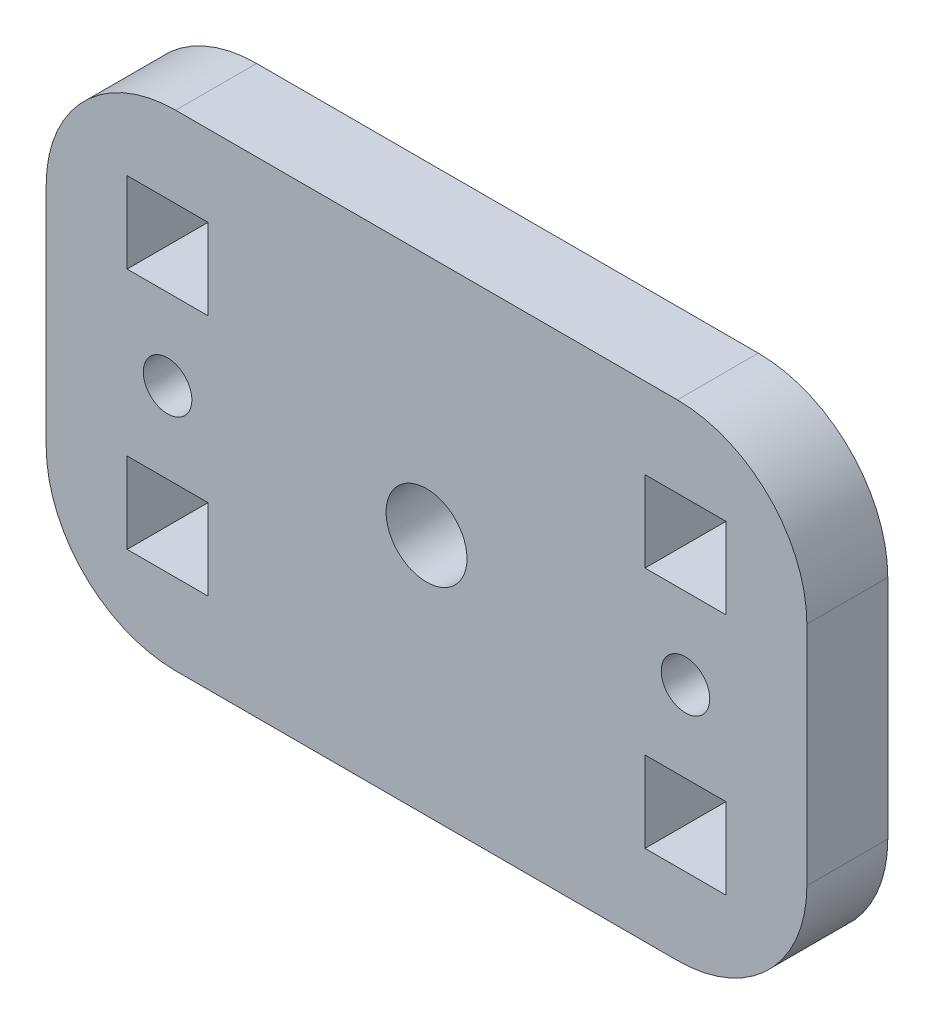
ISO-10303-21;
HEADER;
FILE_DESCRIPTION(('STEP AP214'),'2;1');
FILE_NAME('part.step','',(''),(''),'','','');
FILE_SCHEMA(('AUTOMOTIVE_DESIGN { 1 0 10303 214 1 1 1 1 }'));
ENDSEC;
DATA;
#1=APPLICATION_CONTEXT('core data for automotive mechanical design processes');
#2=APPLICATION_PROTOCOL_DEFINITION('international standard','automotive_design',2000,#1);
#3=PRODUCT_CONTEXT('',#1,'mechanical');
#4=PRODUCT('Part','Part','',(#3));
#5=PRODUCT_RELATED_PRODUCT_CATEGORY('part','',(#4));
#6=PRODUCT_DEFINITION_FORMATION('','',#4);
#7=PRODUCT_DEFINITION_CONTEXT('part definition',#1,'design');
#8=PRODUCT_DEFINITION('design','',#6,#7);
#9=PRODUCT_DEFINITION_SHAPE('','',#8);
#10=(LENGTH_UNIT() NAMED_UNIT(*) SI_UNIT(.MILLI.,.METRE.));
#11=(NAMED_UNIT(*) PLANE_ANGLE_UNIT() SI_UNIT($,.RADIAN.));
#12=(NAMED_UNIT(*) SI_UNIT($,.STERADIAN.) SOLID_ANGLE_UNIT());
#13=UNCERTAINTY_MEASURE_WITH_UNIT(LENGTH_MEASURE(1.E-05),#10,'distance_accuracy_value','');
#14=(GEOMETRIC_REPRESENTATION_CONTEXT(3) GLOBAL_UNCERTAINTY_ASSIGNED_CONTEXT((#13)) GLOBAL_UNIT_ASSIGNED_CONTEXT((#10,
#11,#12)) REPRESENTATION_CONTEXT('',''));
#15=CARTESIAN_POINT('',(0.,0.,0.));
#16=DIRECTION('',(0.,0.,1.));
#17=DIRECTION('',(1.,0.,0.));
#18=AXIS2_PLACEMENT_3D('',#15,#16,#17);
#19=CARTESIAN_POINT('',(8.,8.,5.));
#20=DIRECTION('',(0.,0.,-1.));
#21=DIRECTION('',(-1.,0.,0.));
#22=AXIS2_PLACEMENT_3D('',#19,#20,#21);
#23=PLANE('',#22);
#24=DIRECTION('',(1.,0.,0.));
#25=VECTOR('',#24,1.);
#26=CARTESIAN_POINT('',(37.,5.,5.));
#27=LINE('',#26,#25);
#28=CARTESIAN_POINT('',(37.,5.,5.));
#29=VERTEX_POINT('',#28);
#30=CARTESIAN_POINT('',(42.,5.,5.));
#31=VERTEX_POINT('',#30);
#32=EDGE_CURVE('E233',#29,#31,#27,.T.);
#33=ORIENTED_EDGE('',*,*,#32,.F.);
#34=DIRECTION('',(0.,-1.,0.));
#35=VECTOR('',#34,1.);
#36=CARTESIAN_POINT('',(37.,5.,5.));
#37=LINE('',#36,#35);
#38=CARTESIAN_POINT('',(37.,9.99999999999999,5.));
#39=VERTEX_POINT('',#38);
#40=EDGE_CURVE('E241',#39,#29,#37,.T.);
#41=ORIENTED_EDGE('',*,*,#40,.F.);
#42=DIRECTION('',(-1.,0.,0.));
#43=VECTOR('',#42,1.);
#44=CARTESIAN_POINT('',(37.,9.99999999999999,5.));
#45=LINE('',#44,#43);
#46=CARTESIAN_POINT('',(42.,9.99999999999999,5.));
#47=VERTEX_POINT('',#46);
#48=EDGE_CURVE('E238',#47,#39,#45,.T.);
#49=ORIENTED_EDGE('',*,*,#48,.F.);
#50=DIRECTION('',(0.,1.,0.));
#51=VECTOR('',#50,1.);
#52=CARTESIAN_POINT('',(42.,5.,5.));
#53=LINE('',#52,#51);
#54=EDGE_CURVE('E235',#31,#47,#53,.T.);
#55=ORIENTED_EDGE('',*,*,#54,.F.);
#56=EDGE_LOOP('',(#33,#41,#49,#55));
#57=FACE_BOUND('',#56,.T.);
#58=CARTESIAN_POINT('',(7.5,15.,5.));
#59=DIRECTION('',(0.,0.,1.));
#60=DIRECTION('',(1.,0.,0.));
#61=AXIS2_PLACEMENT_3D('',#58,#59,#60);
#62=CIRCLE('',#61,1.5);
#63=CARTESIAN_POINT('',(9.,15.,5.));
#64=VERTEX_POINT('',#63);
#65=EDGE_CURVE('E301',#64,#64,#62,.T.);
#66=ORIENTED_EDGE('',*,*,#65,.F.);
#67=EDGE_LOOP('',(#66));
#68=FACE_BOUND('',#67,.T.);
#69=DIRECTION('',(0.,-1.,0.));
#70=VECTOR('',#69,1.);
#71=CARTESIAN_POINT('',(5.,25.,5.));
#72=LINE('',#71,#70);
#73=CARTESIAN_POINT('',(5.,25.,5.));
#74=VERTEX_POINT('',#73);
#75=CARTESIAN_POINT('',(5.,20.,5.));
#76=VERTEX_POINT('',#75);
#77=EDGE_CURVE('E307',#74,#76,#72,.T.);
#78=ORIENTED_EDGE('',*,*,#77,.F.);
#79=DIRECTION('',(-1.,0.,0.));
#80=VECTOR('',#79,1.);
#81=CARTESIAN_POINT('',(5.,25.,5.));
#82=LINE('',#81,#80);
#83=CARTESIAN_POINT('',(10.,25.,5.));
#84=VERTEX_POINT('',#83);
#85=EDGE_CURVE('E315',#84,#74,#82,.T.);
#86=ORIENTED_EDGE('',*,*,#85,.F.);
#87=DIRECTION('',(0.,1.,0.));
#88=VECTOR('',#87,1.);
#89=CARTESIAN_POINT('',(10.,25.,5.));
#90=LINE('',#89,#88);
#91=CARTESIAN_POINT('',(10.,20.,5.));
#92=VERTEX_POINT('',#91);
#93=EDGE_CURVE('E312',#92,#84,#90,.T.);
#94=ORIENTED_EDGE('',*,*,#93,.F.);
#95=DIRECTION('',(1.,0.,0.));
#96=VECTOR('',#95,1.);
#97=CARTESIAN_POINT('',(5.,20.,5.));
#98=LINE('',#97,#96);
#99=EDGE_CURVE('E309',#76,#92,#98,.T.);
#100=ORIENTED_EDGE('',*,*,#99,.F.);
#101=EDGE_LOOP('',(#78,#86,#94,#100));
#102=FACE_BOUND('',#101,.T.);
#103=CARTESIAN_POINT('',(8.,8.,5.));
#104=DIRECTION('',(0.,0.,1.));
#105=DIRECTION('',(-1.,0.,0.));
#106=AXIS2_PLACEMENT_3D('',#103,#104,#105);
#107=CIRCLE('',#106,8.);
#108=CARTESIAN_POINT('',(0.,8.00000000000006,5.));
#109=VERTEX_POINT('',#108);
#110=CARTESIAN_POINT('',(8.00000000000006,0.,5.));
#111=VERTEX_POINT('',#110);
#112=EDGE_CURVE('E338',#109,#111,#107,.T.);
#113=ORIENTED_EDGE('',*,*,#112,.T.);
#114=DIRECTION('',(1.,0.,0.));
#115=VECTOR('',#114,1.);
#116=CARTESIAN_POINT('',(8.00000000000006,0.,5.));
#117=LINE('',#116,#115);
#118=CARTESIAN_POINT('',(39.,0.,5.));
#119=VERTEX_POINT('',#118);
#120=EDGE_CURVE('E341',#111,#119,#117,.T.);
#121=ORIENTED_EDGE('',*,*,#120,.T.);
#122=CARTESIAN_POINT('',(39.,8.,5.));
#123=DIRECTION('',(0.,0.,1.));
#124=DIRECTION('',(1.,0.,0.));
#125=AXIS2_PLACEMENT_3D('',#122,#123,#124);
#126=CIRCLE('',#125,8.);
#127=CARTESIAN_POINT('',(47.,8.,5.));
#128=VERTEX_POINT('',#127);
#129=EDGE_CURVE('E344',#119,#128,#126,.T.);
#130=ORIENTED_EDGE('',*,*,#129,.T.);
#131=DIRECTION('',(0.,1.,0.));
#132=VECTOR('',#131,1.);
#133=CARTESIAN_POINT('',(47.,8.,5.));
#134=LINE('',#133,#132);
#135=CARTESIAN_POINT('',(47.,22.,5.));
#136=VERTEX_POINT('',#135);
#137=EDGE_CURVE('E346',#128,#136,#134,.T.);
#138=ORIENTED_EDGE('',*,*,#137,.T.);
#139=CARTESIAN_POINT('',(39.,22.,5.));
#140=DIRECTION('',(0.,0.,1.));
#141=DIRECTION('',(-1.,0.,0.));
#142=AXIS2_PLACEMENT_3D('',#139,#140,#141);
#143=CIRCLE('',#142,8.);
#144=CARTESIAN_POINT('',(39.,30.,5.));
#145=VERTEX_POINT('',#144);
#146=EDGE_CURVE('E348',#136,#145,#143,.T.);
#147=ORIENTED_EDGE('',*,*,#146,.T.);
#148=DIRECTION('',(-1.,0.,0.));
#149=VECTOR('',#148,1.);
#150=CARTESIAN_POINT('',(8.,30.,5.));
#151=LINE('',#150,#149);
#152=CARTESIAN_POINT('',(8.,30.,5.));
#153=VERTEX_POINT('',#152);
#154=EDGE_CURVE('E350',#145,#153,#151,.T.);
#155=ORIENTED_EDGE('',*,*,#154,.T.);
#156=CARTESIAN_POINT('',(8.,22.,5.));
#157=DIRECTION('',(0.,0.,1.));
#158=DIRECTION('',(-1.,0.,0.));
#159=AXIS2_PLACEMENT_3D('',#156,#157,#158);
#160=CIRCLE('',#159,8.);
#161=CARTESIAN_POINT('',(0.,22.,5.));
#162=VERTEX_POINT('',#161);
#163=EDGE_CURVE('E352',#153,#162,#160,.T.);
#164=ORIENTED_EDGE('',*,*,#163,.T.);
#165=DIRECTION('',(0.,-1.,0.));
#166=VECTOR('',#165,1.);
#167=CARTESIAN_POINT('',(0.,8.00000000000006,5.));
#168=LINE('',#167,#166);
#169=EDGE_CURVE('E354',#162,#109,#168,.T.);
#170=ORIENTED_EDGE('',*,*,#169,.T.);
#171=EDGE_LOOP('',(#113,#121,#130,#138,#147,#155,#164,#170));
#172=FACE_BOUND('',#171,.T.);
#173=DIRECTION('',(0.,-1.,0.));
#174=VECTOR('',#173,1.);
#175=CARTESIAN_POINT('',(37.,25.,5.));
#176=LINE('',#175,#174);
#177=CARTESIAN_POINT('',(37.,25.,5.));
#178=VERTEX_POINT('',#177);
#179=CARTESIAN_POINT('',(37.,20.,5.));
#180=VERTEX_POINT('',#179);
#181=EDGE_CURVE('E270',#178,#180,#176,.T.);
#182=ORIENTED_EDGE('',*,*,#181,.F.);
#183=DIRECTION('',(-1.,0.,0.));
#184=VECTOR('',#183,1.);
#185=CARTESIAN_POINT('',(37.,25.,5.));
#186=LINE('',#185,#184);
#187=CARTESIAN_POINT('',(42.,25.,5.));
#188=VERTEX_POINT('',#187);
#189=EDGE_CURVE('E278',#188,#178,#186,.T.);
#190=ORIENTED_EDGE('',*,*,#189,.F.);
#191=DIRECTION('',(0.,1.,0.));
#192=VECTOR('',#191,1.);
#193=CARTESIAN_POINT('',(42.,25.,5.));
#194=LINE('',#193,#192);
#195=CARTESIAN_POINT('',(42.,20.,5.));
#196=VERTEX_POINT('',#195);
#197=EDGE_CURVE('E275',#196,#188,#194,.T.);
#198=ORIENTED_EDGE('',*,*,#197,.F.);
#199=DIRECTION('',(1.,0.,0.));
#200=VECTOR('',#199,1.);
#201=CARTESIAN_POINT('',(37.,20.,5.));
#202=LINE('',#201,#200);
#203=EDGE_CURVE('E272',#180,#196,#202,.T.);
#204=ORIENTED_EDGE('',*,*,#203,.F.);
#205=EDGE_LOOP('',(#182,#190,#198,#204));
#206=FACE_BOUND('',#205,.T.);
#207=CARTESIAN_POINT('',(39.5,15.,5.));
#208=DIRECTION('',(0.,0.,1.));
#209=DIRECTION('',(1.,0.,0.));
#210=AXIS2_PLACEMENT_3D('',#207,#208,#209);
#211=CIRCLE('',#210,1.5);
#212=CARTESIAN_POINT('',(41.,15.,5.));
#213=VERTEX_POINT('',#212);
#214=EDGE_CURVE('E264',#213,#213,#211,.T.);
#215=ORIENTED_EDGE('',*,*,#214,.F.);
#216=EDGE_LOOP('',(#215));
#217=FACE_BOUND('',#216,.T.);
#218=DIRECTION('',(1.,0.,0.));
#219=VECTOR('',#218,1.);
#220=CARTESIAN_POINT('',(5.,4.99999999999999,5.));
#221=LINE('',#220,#219);
#222=CARTESIAN_POINT('',(5.,4.99999999999999,5.));
#223=VERTEX_POINT('',#222);
#224=CARTESIAN_POINT('',(10.,4.99999999999999,5.));
#225=VERTEX_POINT('',#224);
#226=EDGE_CURVE('E194',#223,#225,#221,.T.);
#227=ORIENTED_EDGE('',*,*,#226,.F.);
#228=DIRECTION('',(0.,-1.,0.));
#229=VECTOR('',#228,1.);
#230=CARTESIAN_POINT('',(5.,4.99999999999999,5.));
#231=LINE('',#230,#229);
#232=CARTESIAN_POINT('',(4.99999999999999,9.99999999999999,5.));
#233=VERTEX_POINT('',#232);
#234=EDGE_CURVE('E217',#233,#223,#231,.T.);
#235=ORIENTED_EDGE('',*,*,#234,.F.);
#236=DIRECTION('',(-1.,0.,0.));
#237=VECTOR('',#236,1.);
#238=CARTESIAN_POINT('',(4.99999999999999,9.99999999999999,5.));
#239=LINE('',#238,#237);
#240=CARTESIAN_POINT('',(9.99999999999999,9.99999999999999,5.));
#241=VERTEX_POINT('',#240);
#242=EDGE_CURVE('E215',#241,#233,#239,.T.);
#243=ORIENTED_EDGE('',*,*,#242,.F.);
#244=DIRECTION('',(0.,1.,0.));
#245=VECTOR('',#244,1.);
#246=CARTESIAN_POINT('',(10.,4.99999999999999,5.));
#247=LINE('',#246,#245);
#248=EDGE_CURVE('E202',#225,#241,#247,.T.);
#249=ORIENTED_EDGE('',*,*,#248,.F.);
#250=EDGE_LOOP('',(#227,#235,#243,#249));
#251=FACE_BOUND('',#250,.T.);
#252=CARTESIAN_POINT('',(23.5,15.,5.));
#253=DIRECTION('',(0.,0.,1.));
#254=DIRECTION('',(1.,0.,0.));
#255=AXIS2_PLACEMENT_3D('',#252,#253,#254);
#256=CIRCLE('',#255,2.5);
#257=CARTESIAN_POINT('',(26.,15.,5.));
#258=VERTEX_POINT('',#257);
#259=EDGE_CURVE('E223',#258,#258,#256,.T.);
#260=ORIENTED_EDGE('',*,*,#259,.F.);
#261=EDGE_LOOP('',(#260));
#262=FACE_BOUND('',#261,.T.);
#263=ADVANCED_FACE('F33',(#57,#68,#102,#172,#206,#217,#251,#262),#23,.F.);
#264=CARTESIAN_POINT('',(8.,8.,0.));
#265=DIRECTION('',(0.,0.,-1.));
#266=DIRECTION('',(-1.,0.,0.));
#267=AXIS2_PLACEMENT_3D('',#264,#265,#266);
#268=PLANE('',#267);
#269=DIRECTION('',(0.,-1.,0.));
#270=VECTOR('',#269,1.);
#271=CARTESIAN_POINT('',(5.,4.99999999999999,0.));
#272=LINE('',#271,#270);
#273=CARTESIAN_POINT('',(4.99999999999999,9.99999999999999,0.));
#274=VERTEX_POINT('',#273);
#275=CARTESIAN_POINT('',(5.,4.99999999999999,0.));
#276=VERTEX_POINT('',#275);
#277=EDGE_CURVE('E203',#274,#276,#272,.T.);
#278=ORIENTED_EDGE('',*,*,#277,.T.);
#279=DIRECTION('',(1.,0.,0.));
#280=VECTOR('',#279,1.);
#281=CARTESIAN_POINT('',(5.,4.99999999999999,0.));
#282=LINE('',#281,#280);
#283=CARTESIAN_POINT('',(10.,4.99999999999999,0.));
#284=VERTEX_POINT('',#283);
#285=EDGE_CURVE('E56',#276,#284,#282,.T.);
#286=ORIENTED_EDGE('',*,*,#285,.T.);
#287=DIRECTION('',(0.,1.,0.));
#288=VECTOR('',#287,1.);
#289=CARTESIAN_POINT('',(10.,4.99999999999999,0.));
#290=LINE('',#289,#288);
#291=CARTESIAN_POINT('',(9.99999999999999,9.99999999999999,0.));
#292=VERTEX_POINT('',#291);
#293=EDGE_CURVE('E209',#284,#292,#290,.T.);
#294=ORIENTED_EDGE('',*,*,#293,.T.);
#295=DIRECTION('',(-1.,0.,0.));
#296=VECTOR('',#295,1.);
#297=CARTESIAN_POINT('',(4.99999999999999,9.99999999999999,0.));
#298=LINE('',#297,#296);
#299=EDGE_CURVE('E225',#292,#274,#298,.T.);
#300=ORIENTED_EDGE('',*,*,#299,.T.);
#301=EDGE_LOOP('',(#278,#286,#294,#300));
#302=FACE_BOUND('',#301,.T.);
#303=DIRECTION('',(0.,-1.,0.));
#304=VECTOR('',#303,1.);
#305=CARTESIAN_POINT('',(37.,5.,0.));
#306=LINE('',#305,#304);
#307=CARTESIAN_POINT('',(37.,9.99999999999999,0.));
#308=VERTEX_POINT('',#307);
#309=CARTESIAN_POINT('',(37.,5.,0.));
#310=VERTEX_POINT('',#309);
#311=EDGE_CURVE('E236',#308,#310,#306,.T.);
#312=ORIENTED_EDGE('',*,*,#311,.T.);
#313=DIRECTION('',(1.,0.,0.));
#314=VECTOR('',#313,1.);
#315=CARTESIAN_POINT('',(37.,5.,0.));
#316=LINE('',#315,#314);
#317=CARTESIAN_POINT('',(42.,5.,0.));
#318=VERTEX_POINT('',#317);
#319=EDGE_CURVE('E210',#310,#318,#316,.T.);
#320=ORIENTED_EDGE('',*,*,#319,.T.);
#321=DIRECTION('',(0.,1.,0.));
#322=VECTOR('',#321,1.);
#323=CARTESIAN_POINT('',(42.,5.,0.));
#324=LINE('',#323,#322);
#325=CARTESIAN_POINT('',(42.,9.99999999999999,0.));
#326=VERTEX_POINT('',#325);
#327=EDGE_CURVE('E246',#318,#326,#324,.T.);
#328=ORIENTED_EDGE('',*,*,#327,.T.);
#329=DIRECTION('',(-1.,0.,0.));
#330=VECTOR('',#329,1.);
#331=CARTESIAN_POINT('',(37.,9.99999999999999,0.));
#332=LINE('',#331,#330);
#333=EDGE_CURVE('E249',#326,#308,#332,.T.);
#334=ORIENTED_EDGE('',*,*,#333,.T.);
#335=EDGE_LOOP('',(#312,#320,#328,#334));
#336=FACE_BOUND('',#335,.T.);
#337=CARTESIAN_POINT('',(39.5,15.,0.));
#338=DIRECTION('',(0.,0.,1.));
#339=DIRECTION('',(1.,0.,0.));
#340=AXIS2_PLACEMENT_3D('',#337,#338,#339);
#341=CIRCLE('',#340,1.5);
#342=CARTESIAN_POINT('',(41.,15.,0.));
#343=VERTEX_POINT('',#342);
#344=EDGE_CURVE('E263',#343,#343,#341,.T.);
#345=ORIENTED_EDGE('',*,*,#344,.T.);
#346=EDGE_LOOP('',(#345));
#347=FACE_BOUND('',#346,.T.);
#348=DIRECTION('',(-1.,0.,0.));
#349=VECTOR('',#348,1.);
#350=CARTESIAN_POINT('',(5.,25.,0.));
#351=LINE('',#350,#349);
#352=CARTESIAN_POINT('',(10.,25.,0.));
#353=VERTEX_POINT('',#352);
#354=CARTESIAN_POINT('',(5.,25.,0.));
#355=VERTEX_POINT('',#354);
#356=EDGE_CURVE('E310',#353,#355,#351,.T.);
#357=ORIENTED_EDGE('',*,*,#356,.T.);
#358=DIRECTION('',(0.,-1.,0.));
#359=VECTOR('',#358,1.);
#360=CARTESIAN_POINT('',(5.,25.,0.));
#361=LINE('',#360,#359);
#362=CARTESIAN_POINT('',(5.,20.,0.));
#363=VERTEX_POINT('',#362);
#364=EDGE_CURVE('E304',#355,#363,#361,.T.);
#365=ORIENTED_EDGE('',*,*,#364,.T.);
#366=DIRECTION('',(1.,0.,0.));
#367=VECTOR('',#366,1.);
#368=CARTESIAN_POINT('',(5.,20.,0.));
#369=LINE('',#368,#367);
#370=CARTESIAN_POINT('',(10.,20.,0.));
#371=VERTEX_POINT('',#370);
#372=EDGE_CURVE('E320',#363,#371,#369,.T.);
#373=ORIENTED_EDGE('',*,*,#372,.T.);
#374=DIRECTION('',(0.,1.,0.));
#375=VECTOR('',#374,1.);
#376=CARTESIAN_POINT('',(10.,25.,0.));
#377=LINE('',#376,#375);
#378=EDGE_CURVE('E323',#371,#353,#377,.T.);
#379=ORIENTED_EDGE('',*,*,#378,.T.);
#380=EDGE_LOOP('',(#357,#365,#373,#379));
#381=FACE_BOUND('',#380,.T.);
#382=CARTESIAN_POINT('',(8.,8.,0.));
#383=DIRECTION('',(0.,0.,1.));
#384=DIRECTION('',(-1.,0.,0.));
#385=AXIS2_PLACEMENT_3D('',#382,#383,#384);
#386=CIRCLE('',#385,8.);
#387=CARTESIAN_POINT('',(0.,8.00000000000006,0.));
#388=VERTEX_POINT('',#387);
#389=CARTESIAN_POINT('',(8.00000000000006,0.,0.));
#390=VERTEX_POINT('',#389);
#391=EDGE_CURVE('E337',#388,#390,#386,.T.);
#392=ORIENTED_EDGE('',*,*,#391,.F.);
#393=DIRECTION('',(0.,-1.,0.));
#394=VECTOR('',#393,1.);
#395=CARTESIAN_POINT('',(0.,8.00000000000006,0.));
#396=LINE('',#395,#394);
#397=CARTESIAN_POINT('',(0.,22.,0.));
#398=VERTEX_POINT('',#397);
#399=EDGE_CURVE('E342',#398,#388,#396,.T.);
#400=ORIENTED_EDGE('',*,*,#399,.F.);
#401=CARTESIAN_POINT('',(8.,22.,0.));
#402=DIRECTION('',(0.,0.,1.));
#403=DIRECTION('',(-1.,0.,0.));
#404=AXIS2_PLACEMENT_3D('',#401,#402,#403);
#405=CIRCLE('',#404,8.);
#406=CARTESIAN_POINT('',(8.,30.,0.));
#407=VERTEX_POINT('',#406);
#408=EDGE_CURVE('E369',#407,#398,#405,.T.);
#409=ORIENTED_EDGE('',*,*,#408,.F.);
#410=DIRECTION('',(-1.,0.,0.));
#411=VECTOR('',#410,1.);
#412=CARTESIAN_POINT('',(8.,30.,0.));
#413=LINE('',#412,#411);
#414=CARTESIAN_POINT('',(39.,30.,0.));
#415=VERTEX_POINT('',#414);
#416=EDGE_CURVE('E367',#415,#407,#413,.T.);
#417=ORIENTED_EDGE('',*,*,#416,.F.);
#418=CARTESIAN_POINT('',(39.,22.,0.));
#419=DIRECTION('',(0.,0.,1.));
#420=DIRECTION('',(-1.,0.,0.));
#421=AXIS2_PLACEMENT_3D('',#418,#419,#420);
#422=CIRCLE('',#421,8.);
#423=CARTESIAN_POINT('',(47.,22.,0.));
#424=VERTEX_POINT('',#423);
#425=EDGE_CURVE('E365',#424,#415,#422,.T.);
#426=ORIENTED_EDGE('',*,*,#425,.F.);
#427=DIRECTION('',(0.,1.,0.));
#428=VECTOR('',#427,1.);
#429=CARTESIAN_POINT('',(47.,8.,0.));
#430=LINE('',#429,#428);
#431=CARTESIAN_POINT('',(47.,8.,0.));
#432=VERTEX_POINT('',#431);
#433=EDGE_CURVE('E363',#432,#424,#430,.T.);
#434=ORIENTED_EDGE('',*,*,#433,.F.);
#435=CARTESIAN_POINT('',(39.,8.,0.));
#436=DIRECTION('',(0.,0.,1.));
#437=DIRECTION('',(1.,0.,0.));
#438=AXIS2_PLACEMENT_3D('',#435,#436,#437);
#439=CIRCLE('',#438,8.);
#440=CARTESIAN_POINT('',(39.,0.,0.));
#441=VERTEX_POINT('',#440);
#442=EDGE_CURVE('E361',#441,#432,#439,.T.);
#443=ORIENTED_EDGE('',*,*,#442,.F.);
#444=DIRECTION('',(1.,0.,0.));
#445=VECTOR('',#444,1.);
#446=CARTESIAN_POINT('',(8.00000000000006,0.,0.));
#447=LINE('',#446,#445);
#448=EDGE_CURVE('E359',#390,#441,#447,.T.);
#449=ORIENTED_EDGE('',*,*,#448,.F.);
#450=EDGE_LOOP('',(#392,#400,#409,#417,#426,#434,#443,#449));
#451=FACE_BOUND('',#450,.T.);
#452=CARTESIAN_POINT('',(7.5,15.,0.));
#453=DIRECTION('',(0.,0.,1.));
#454=DIRECTION('',(1.,0.,0.));
#455=AXIS2_PLACEMENT_3D('',#452,#453,#454);
#456=CIRCLE('',#455,1.5);
#457=CARTESIAN_POINT('',(9.,15.,0.));
#458=VERTEX_POINT('',#457);
#459=EDGE_CURVE('E300',#458,#458,#456,.T.);
#460=ORIENTED_EDGE('',*,*,#459,.T.);
#461=EDGE_LOOP('',(#460));
#462=FACE_BOUND('',#461,.T.);
#463=DIRECTION('',(-1.,0.,0.));
#464=VECTOR('',#463,1.);
#465=CARTESIAN_POINT('',(37.,25.,0.));
#466=LINE('',#465,#464);
#467=CARTESIAN_POINT('',(42.,25.,0.));
#468=VERTEX_POINT('',#467);
#469=CARTESIAN_POINT('',(37.,25.,0.));
#470=VERTEX_POINT('',#469);
#471=EDGE_CURVE('E273',#468,#470,#466,.T.);
#472=ORIENTED_EDGE('',*,*,#471,.T.);
#473=DIRECTION('',(0.,-1.,0.));
#474=VECTOR('',#473,1.);
#475=CARTESIAN_POINT('',(37.,25.,0.));
#476=LINE('',#475,#474);
#477=CARTESIAN_POINT('',(37.,20.,0.));
#478=VERTEX_POINT('',#477);
#479=EDGE_CURVE('E267',#470,#478,#476,.T.);
#480=ORIENTED_EDGE('',*,*,#479,.T.);
#481=DIRECTION('',(1.,0.,0.));
#482=VECTOR('',#481,1.);
#483=CARTESIAN_POINT('',(37.,20.,0.));
#484=LINE('',#483,#482);
#485=CARTESIAN_POINT('',(42.,20.,0.));
#486=VERTEX_POINT('',#485);
#487=EDGE_CURVE('E283',#478,#486,#484,.T.);
#488=ORIENTED_EDGE('',*,*,#487,.T.);
#489=DIRECTION('',(0.,1.,0.));
#490=VECTOR('',#489,1.);
#491=CARTESIAN_POINT('',(42.,25.,0.));
#492=LINE('',#491,#490);
#493=EDGE_CURVE('E286',#486,#468,#492,.T.);
#494=ORIENTED_EDGE('',*,*,#493,.T.);
#495=EDGE_LOOP('',(#472,#480,#488,#494));
#496=FACE_BOUND('',#495,.T.);
#497=CARTESIAN_POINT('',(23.5,15.,0.));
#498=DIRECTION('',(0.,0.,1.));
#499=DIRECTION('',(1.,0.,0.));
#500=AXIS2_PLACEMENT_3D('',#497,#498,#499);
#501=CIRCLE('',#500,2.5);
#502=CARTESIAN_POINT('',(26.,15.,0.));
#503=VERTEX_POINT('',#502);
#504=EDGE_CURVE('E546',#503,#503,#501,.T.);
#505=ORIENTED_EDGE('',*,*,#504,.T.);
#506=EDGE_LOOP('',(#505));
#507=FACE_BOUND('',#506,.T.);
#508=ADVANCED_FACE('F399',(#302,#336,#347,#381,#451,#462,#496,#507),#268,.T.);
#509=CARTESIAN_POINT('',(8.,8.,5.));
#510=DIRECTION('',(0.,0.,-1.));
#511=DIRECTION('',(-1.,0.,0.));
#512=AXIS2_PLACEMENT_3D('',#509,#510,#511);
#513=CYLINDRICAL_SURFACE('',#512,8.);
#514=ORIENTED_EDGE('',*,*,#391,.T.);
#515=DIRECTION('',(0.,0.,-1.));
#516=VECTOR('',#515,1.);
#517=CARTESIAN_POINT('',(8.00000000000006,0.,5.));
#518=LINE('',#517,#516);
#519=EDGE_CURVE('E11',#111,#390,#518,.T.);
#520=ORIENTED_EDGE('',*,*,#519,.F.);
#521=ORIENTED_EDGE('',*,*,#112,.F.);
#522=DIRECTION('',(0.,0.,-1.));
#523=VECTOR('',#522,1.);
#524=CARTESIAN_POINT('',(0.,8.00000000000006,5.));
#525=LINE('',#524,#523);
#526=EDGE_CURVE('E356',#109,#388,#525,.T.);
#527=ORIENTED_EDGE('',*,*,#526,.T.);
#528=EDGE_LOOP('',(#514,#520,#521,#527));
#529=FACE_BOUND('',#528,.T.);
#530=ADVANCED_FACE('F35',(#529),#513,.T.);
#531=CARTESIAN_POINT('',(8.00000000000006,0.,5.));
#532=DIRECTION('',(0.,1.,0.));
#533=DIRECTION('',(0.,0.,1.));
#534=AXIS2_PLACEMENT_3D('',#531,#532,#533);
#535=PLANE('',#534);
#536=ORIENTED_EDGE('',*,*,#448,.T.);
#537=DIRECTION('',(0.,0.,-1.));
#538=VECTOR('',#537,1.);
#539=CARTESIAN_POINT('',(39.,0.,5.));
#540=LINE('',#539,#538);
#541=EDGE_CURVE('E41',#119,#441,#540,.T.);
#542=ORIENTED_EDGE('',*,*,#541,.F.);
#543=ORIENTED_EDGE('',*,*,#120,.F.);
#544=ORIENTED_EDGE('',*,*,#519,.T.);
#545=EDGE_LOOP('',(#536,#542,#543,#544));
#546=FACE_BOUND('',#545,.T.);
#547=ADVANCED_FACE('F417',(#546),#535,.F.);
#548=CARTESIAN_POINT('',(39.,8.,5.));
#549=DIRECTION('',(0.,0.,-1.));
#550=DIRECTION('',(-1.,0.,0.));
#551=AXIS2_PLACEMENT_3D('',#548,#549,#550);
#552=CYLINDRICAL_SURFACE('',#551,8.);
#553=ORIENTED_EDGE('',*,*,#442,.T.);
#554=DIRECTION('',(0.,0.,-1.));
#555=VECTOR('',#554,1.);
#556=CARTESIAN_POINT('',(47.,8.,5.));
#557=LINE('',#556,#555);
#558=EDGE_CURVE('E386',#128,#432,#557,.T.);
#559=ORIENTED_EDGE('',*,*,#558,.F.);
#560=ORIENTED_EDGE('',*,*,#129,.F.);
#561=ORIENTED_EDGE('',*,*,#541,.T.);
#562=EDGE_LOOP('',(#553,#559,#560,#561));
#563=FACE_BOUND('',#562,.T.);
#564=ADVANCED_FACE('F393',(#563),#552,.T.);
#565=CARTESIAN_POINT('',(47.,8.,5.));
#566=DIRECTION('',(-1.,0.,0.));
#567=DIRECTION('',(0.,0.,1.));
#568=AXIS2_PLACEMENT_3D('',#565,#566,#567);
#569=PLANE('',#568);
#570=ORIENTED_EDGE('',*,*,#433,.T.);
#571=DIRECTION('',(0.,0.,-1.));
#572=VECTOR('',#571,1.);
#573=CARTESIAN_POINT('',(47.,22.,5.));
#574=LINE('',#573,#572);
#575=EDGE_CURVE('E383',#136,#424,#574,.T.);
#576=ORIENTED_EDGE('',*,*,#575,.F.);
#577=ORIENTED_EDGE('',*,*,#137,.F.);
#578=ORIENTED_EDGE('',*,*,#558,.T.);
#579=EDGE_LOOP('',(#570,#576,#577,#578));
#580=FACE_BOUND('',#579,.T.);
#581=ADVANCED_FACE('F405',(#580),#569,.F.);
#582=CARTESIAN_POINT('',(39.,22.,5.));
#583=DIRECTION('',(0.,0.,-1.));
#584=DIRECTION('',(-1.,0.,0.));
#585=AXIS2_PLACEMENT_3D('',#582,#583,#584);
#586=CYLINDRICAL_SURFACE('',#585,8.);
#587=ORIENTED_EDGE('',*,*,#425,.T.);
#588=DIRECTION('',(0.,0.,-1.));
#589=VECTOR('',#588,1.);
#590=CARTESIAN_POINT('',(39.,30.,5.));
#591=LINE('',#590,#589);
#592=EDGE_CURVE('E380',#145,#415,#591,.T.);
#593=ORIENTED_EDGE('',*,*,#592,.F.);
#594=ORIENTED_EDGE('',*,*,#146,.F.);
#595=ORIENTED_EDGE('',*,*,#575,.T.);
#596=EDGE_LOOP('',(#587,#593,#594,#595));
#597=FACE_BOUND('',#596,.T.);
#598=ADVANCED_FACE('F409',(#597),#586,.T.);
#599=CARTESIAN_POINT('',(8.,30.,5.));
#600=DIRECTION('',(0.,-1.,0.));
#601=DIRECTION('',(1.,0.,0.));
#602=AXIS2_PLACEMENT_3D('',#599,#600,#601);
#603=PLANE('',#602);
#604=ORIENTED_EDGE('',*,*,#416,.T.);
#605=DIRECTION('',(0.,0.,-1.));
#606=VECTOR('',#605,1.);
#607=CARTESIAN_POINT('',(8.,30.,5.));
#608=LINE('',#607,#606);
#609=EDGE_CURVE('E377',#153,#407,#608,.T.);
#610=ORIENTED_EDGE('',*,*,#609,.F.);
#611=ORIENTED_EDGE('',*,*,#154,.F.);
#612=ORIENTED_EDGE('',*,*,#592,.T.);
#613=EDGE_LOOP('',(#604,#610,#611,#612));
#614=FACE_BOUND('',#613,.T.);
#615=ADVANCED_FACE('F430',(#614),#603,.F.);
#616=CARTESIAN_POINT('',(8.,22.,5.));
#617=DIRECTION('',(0.,0.,-1.));
#618=DIRECTION('',(-1.,0.,0.));
#619=AXIS2_PLACEMENT_3D('',#616,#617,#618);
#620=CYLINDRICAL_SURFACE('',#619,8.);
#621=ORIENTED_EDGE('',*,*,#408,.T.);
#622=DIRECTION('',(0.,0.,-1.));
#623=VECTOR('',#622,1.);
#624=CARTESIAN_POINT('',(0.,22.,5.));
#625=LINE('',#624,#623);
#626=EDGE_CURVE('E374',#162,#398,#625,.T.);
#627=ORIENTED_EDGE('',*,*,#626,.F.);
#628=ORIENTED_EDGE('',*,*,#163,.F.);
#629=ORIENTED_EDGE('',*,*,#609,.T.);
#630=EDGE_LOOP('',(#621,#627,#628,#629));
#631=FACE_BOUND('',#630,.T.);
#632=ADVANCED_FACE('F428',(#631),#620,.T.);
#633=CARTESIAN_POINT('',(0.,8.00000000000006,5.));
#634=DIRECTION('',(1.,0.,0.));
#635=DIRECTION('',(0.,1.,0.));
#636=AXIS2_PLACEMENT_3D('',#633,#634,#635);
#637=PLANE('',#636);
#638=ORIENTED_EDGE('',*,*,#399,.T.);
#639=ORIENTED_EDGE('',*,*,#526,.F.);
#640=ORIENTED_EDGE('',*,*,#169,.F.);
#641=ORIENTED_EDGE('',*,*,#626,.T.);
#642=EDGE_LOOP('',(#638,#639,#640,#641));
#643=FACE_BOUND('',#642,.T.);
#644=ADVANCED_FACE('F423',(#643),#637,.F.);
#645=CARTESIAN_POINT('',(5.,25.,5.));
#646=DIRECTION('',(1.,0.,0.));
#647=DIRECTION('',(0.,1.,0.));
#648=AXIS2_PLACEMENT_3D('',#645,#646,#647);
#649=PLANE('',#648);
#650=ORIENTED_EDGE('',*,*,#364,.F.);
#651=DIRECTION('',(0.,0.,-1.));
#652=VECTOR('',#651,1.);
#653=CARTESIAN_POINT('',(5.,25.,5.));
#654=LINE('',#653,#652);
#655=EDGE_CURVE('E317',#74,#355,#654,.T.);
#656=ORIENTED_EDGE('',*,*,#655,.F.);
#657=ORIENTED_EDGE('',*,*,#77,.T.);
#658=DIRECTION('',(0.,0.,-1.));
#659=VECTOR('',#658,1.);
#660=CARTESIAN_POINT('',(5.,20.,5.));
#661=LINE('',#660,#659);
#662=EDGE_CURVE('E334',#76,#363,#661,.T.);
#663=ORIENTED_EDGE('',*,*,#662,.T.);
#664=EDGE_LOOP('',(#650,#656,#657,#663));
#665=FACE_BOUND('',#664,.T.);
#666=ADVANCED_FACE('F450',(#665),#649,.T.);
#667=CARTESIAN_POINT('',(5.,20.,5.));
#668=DIRECTION('',(0.,1.,0.));
#669=DIRECTION('',(-1.,0.,0.));
#670=AXIS2_PLACEMENT_3D('',#667,#668,#669);
#671=PLANE('',#670);
#672=ORIENTED_EDGE('',*,*,#372,.F.);
#673=ORIENTED_EDGE('',*,*,#662,.F.);
#674=ORIENTED_EDGE('',*,*,#99,.T.);
#675=DIRECTION('',(0.,0.,-1.));
#676=VECTOR('',#675,1.);
#677=CARTESIAN_POINT('',(10.,20.,5.));
#678=LINE('',#677,#676);
#679=EDGE_CURVE('E332',#92,#371,#678,.T.);
#680=ORIENTED_EDGE('',*,*,#679,.T.);
#681=EDGE_LOOP('',(#672,#673,#674,#680));
#682=FACE_BOUND('',#681,.T.);
#683=ADVANCED_FACE('F457',(#682),#671,.T.);
#684=CARTESIAN_POINT('',(10.,25.,5.));
#685=DIRECTION('',(-1.,0.,0.));
#686=DIRECTION('',(0.,0.,1.));
#687=AXIS2_PLACEMENT_3D('',#684,#685,#686);
#688=PLANE('',#687);
#689=ORIENTED_EDGE('',*,*,#378,.F.);
#690=ORIENTED_EDGE('',*,*,#679,.F.);
#691=ORIENTED_EDGE('',*,*,#93,.T.);
#692=DIRECTION('',(0.,0.,-1.));
#693=VECTOR('',#692,1.);
#694=CARTESIAN_POINT('',(10.,25.,5.));
#695=LINE('',#694,#693);
#696=EDGE_CURVE('E330',#84,#353,#695,.T.);
#697=ORIENTED_EDGE('',*,*,#696,.T.);
#698=EDGE_LOOP('',(#689,#690,#691,#697));
#699=FACE_BOUND('',#698,.T.);
#700=ADVANCED_FACE('F462',(#699),#688,.T.);
#701=CARTESIAN_POINT('',(5.,25.,5.));
#702=DIRECTION('',(0.,-1.,0.));
#703=DIRECTION('',(1.,0.,0.));
#704=AXIS2_PLACEMENT_3D('',#701,#702,#703);
#705=PLANE('',#704);
#706=ORIENTED_EDGE('',*,*,#356,.F.);
#707=ORIENTED_EDGE('',*,*,#696,.F.);
#708=ORIENTED_EDGE('',*,*,#85,.T.);
#709=ORIENTED_EDGE('',*,*,#655,.T.);
#710=EDGE_LOOP('',(#706,#707,#708,#709));
#711=FACE_BOUND('',#710,.T.);
#712=ADVANCED_FACE('F470',(#711),#705,.T.);
#713=CARTESIAN_POINT('',(7.5,15.,5.));
#714=DIRECTION('',(0.,0.,-1.));
#715=DIRECTION('',(-1.,0.,0.));
#716=AXIS2_PLACEMENT_3D('',#713,#714,#715);
#717=CYLINDRICAL_SURFACE('',#716,1.5);
#718=ORIENTED_EDGE('',*,*,#65,.T.);
#719=EDGE_LOOP('',(#718));
#720=FACE_BOUND('',#719,.T.);
#721=ORIENTED_EDGE('',*,*,#459,.F.);
#722=EDGE_LOOP('',(#721));
#723=FACE_BOUND('',#722,.T.);
#724=ADVANCED_FACE('F483',(#720,#723),#717,.F.);
#725=CARTESIAN_POINT('',(37.,25.,5.));
#726=DIRECTION('',(1.,0.,0.));
#727=DIRECTION('',(0.,1.,0.));
#728=AXIS2_PLACEMENT_3D('',#725,#726,#727);
#729=PLANE('',#728);
#730=ORIENTED_EDGE('',*,*,#479,.F.);
#731=DIRECTION('',(0.,0.,-1.));
#732=VECTOR('',#731,1.);
#733=CARTESIAN_POINT('',(37.,25.,5.));
#734=LINE('',#733,#732);
#735=EDGE_CURVE('E280',#178,#470,#734,.T.);
#736=ORIENTED_EDGE('',*,*,#735,.F.);
#737=ORIENTED_EDGE('',*,*,#181,.T.);
#738=DIRECTION('',(0.,0.,-1.));
#739=VECTOR('',#738,1.);
#740=CARTESIAN_POINT('',(37.,20.,5.));
#741=LINE('',#740,#739);
#742=EDGE_CURVE('E297',#180,#478,#741,.T.);
#743=ORIENTED_EDGE('',*,*,#742,.T.);
#744=EDGE_LOOP('',(#730,#736,#737,#743));
#745=FACE_BOUND('',#744,.T.);
#746=ADVANCED_FACE('F488',(#745),#729,.T.);
#747=CARTESIAN_POINT('',(37.,20.,5.));
#748=DIRECTION('',(0.,1.,0.));
#749=DIRECTION('',(0.,0.,1.));
#750=AXIS2_PLACEMENT_3D('',#747,#748,#749);
#751=PLANE('',#750);
#752=ORIENTED_EDGE('',*,*,#487,.F.);
#753=ORIENTED_EDGE('',*,*,#742,.F.);
#754=ORIENTED_EDGE('',*,*,#203,.T.);
#755=DIRECTION('',(0.,0.,-1.));
#756=VECTOR('',#755,1.);
#757=CARTESIAN_POINT('',(42.,20.,5.));
#758=LINE('',#757,#756);
#759=EDGE_CURVE('E295',#196,#486,#758,.T.);
#760=ORIENTED_EDGE('',*,*,#759,.T.);
#761=EDGE_LOOP('',(#752,#753,#754,#760));
#762=FACE_BOUND('',#761,.T.);
#763=ADVANCED_FACE('F492',(#762),#751,.T.);
#764=CARTESIAN_POINT('',(42.,25.,5.));
#765=DIRECTION('',(-1.,0.,0.));
#766=DIRECTION('',(0.,-1.,0.));
#767=AXIS2_PLACEMENT_3D('',#764,#765,#766);
#768=PLANE('',#767);
#769=ORIENTED_EDGE('',*,*,#493,.F.);
#770=ORIENTED_EDGE('',*,*,#759,.F.);
#771=ORIENTED_EDGE('',*,*,#197,.T.);
#772=DIRECTION('',(0.,0.,-1.));
#773=VECTOR('',#772,1.);
#774=CARTESIAN_POINT('',(42.,25.,5.));
#775=LINE('',#774,#773);
#776=EDGE_CURVE('E293',#188,#468,#775,.T.);
#777=ORIENTED_EDGE('',*,*,#776,.T.);
#778=EDGE_LOOP('',(#769,#770,#771,#777));
#779=FACE_BOUND('',#778,.T.);
#780=ADVANCED_FACE('F496',(#779),#768,.T.);
#781=CARTESIAN_POINT('',(37.,25.,5.));
#782=DIRECTION('',(0.,-1.,0.));
#783=DIRECTION('',(1.,0.,0.));
#784=AXIS2_PLACEMENT_3D('',#781,#782,#783);
#785=PLANE('',#784);
#786=ORIENTED_EDGE('',*,*,#471,.F.);
#787=ORIENTED_EDGE('',*,*,#776,.F.);
#788=ORIENTED_EDGE('',*,*,#189,.T.);
#789=ORIENTED_EDGE('',*,*,#735,.T.);
#790=EDGE_LOOP('',(#786,#787,#788,#789));
#791=FACE_BOUND('',#790,.T.);
#792=ADVANCED_FACE('F500',(#791),#785,.T.);
#793=CARTESIAN_POINT('',(39.5,15.,5.));
#794=DIRECTION('',(0.,0.,-1.));
#795=DIRECTION('',(-1.,0.,0.));
#796=AXIS2_PLACEMENT_3D('',#793,#794,#795);
#797=CYLINDRICAL_SURFACE('',#796,1.5);
#798=ORIENTED_EDGE('',*,*,#214,.T.);
#799=EDGE_LOOP('',(#798));
#800=FACE_BOUND('',#799,.T.);
#801=ORIENTED_EDGE('',*,*,#344,.F.);
#802=EDGE_LOOP('',(#801));
#803=FACE_BOUND('',#802,.T.);
#804=ADVANCED_FACE('F504',(#800,#803),#797,.F.);
#805=CARTESIAN_POINT('',(37.,5.,5.));
#806=DIRECTION('',(0.,1.,0.));
#807=DIRECTION('',(-1.,0.,0.));
#808=AXIS2_PLACEMENT_3D('',#805,#806,#807);
#809=PLANE('',#808);
#810=ORIENTED_EDGE('',*,*,#319,.F.);
#811=DIRECTION('',(0.,0.,-1.));
#812=VECTOR('',#811,1.);
#813=CARTESIAN_POINT('',(37.,5.,5.));
#814=LINE('',#813,#812);
#815=EDGE_CURVE('E243',#29,#310,#814,.T.);
#816=ORIENTED_EDGE('',*,*,#815,.F.);
#817=ORIENTED_EDGE('',*,*,#32,.T.);
#818=DIRECTION('',(0.,0.,-1.));
#819=VECTOR('',#818,1.);
#820=CARTESIAN_POINT('',(42.,5.,5.));
#821=LINE('',#820,#819);
#822=EDGE_CURVE('E260',#31,#318,#821,.T.);
#823=ORIENTED_EDGE('',*,*,#822,.T.);
#824=EDGE_LOOP('',(#810,#816,#817,#823));
#825=FACE_BOUND('',#824,.T.);
#826=ADVANCED_FACE('F508',(#825),#809,.T.);
#827=CARTESIAN_POINT('',(42.,5.,5.));
#828=DIRECTION('',(-1.,0.,0.));
#829=DIRECTION('',(0.,-1.,0.));
#830=AXIS2_PLACEMENT_3D('',#827,#828,#829);
#831=PLANE('',#830);
#832=ORIENTED_EDGE('',*,*,#327,.F.);
#833=ORIENTED_EDGE('',*,*,#822,.F.);
#834=ORIENTED_EDGE('',*,*,#54,.T.);
#835=DIRECTION('',(0.,0.,-1.));
#836=VECTOR('',#835,1.);
#837=CARTESIAN_POINT('',(42.,9.99999999999999,5.));
#838=LINE('',#837,#836);
#839=EDGE_CURVE('E258',#47,#326,#838,.T.);
#840=ORIENTED_EDGE('',*,*,#839,.T.);
#841=EDGE_LOOP('',(#832,#833,#834,#840));
#842=FACE_BOUND('',#841,.T.);
#843=ADVANCED_FACE('F512',(#842),#831,.T.);
#844=CARTESIAN_POINT('',(37.,9.99999999999999,5.));
#845=DIRECTION('',(0.,-1.,0.));
#846=DIRECTION('',(0.,0.,-1.));
#847=AXIS2_PLACEMENT_3D('',#844,#845,#846);
#848=PLANE('',#847);
#849=ORIENTED_EDGE('',*,*,#333,.F.);
#850=ORIENTED_EDGE('',*,*,#839,.F.);
#851=ORIENTED_EDGE('',*,*,#48,.T.);
#852=DIRECTION('',(0.,0.,-1.));
#853=VECTOR('',#852,1.);
#854=CARTESIAN_POINT('',(37.,9.99999999999999,5.));
#855=LINE('',#854,#853);
#856=EDGE_CURVE('E256',#39,#308,#855,.T.);
#857=ORIENTED_EDGE('',*,*,#856,.T.);
#858=EDGE_LOOP('',(#849,#850,#851,#857));
#859=FACE_BOUND('',#858,.T.);
#860=ADVANCED_FACE('F516',(#859),#848,.T.);
#861=CARTESIAN_POINT('',(37.,5.,5.));
#862=DIRECTION('',(1.,0.,0.));
#863=DIRECTION('',(0.,1.,0.));
#864=AXIS2_PLACEMENT_3D('',#861,#862,#863);
#865=PLANE('',#864);
#866=ORIENTED_EDGE('',*,*,#311,.F.);
#867=ORIENTED_EDGE('',*,*,#856,.F.);
#868=ORIENTED_EDGE('',*,*,#40,.T.);
#869=ORIENTED_EDGE('',*,*,#815,.T.);
#870=EDGE_LOOP('',(#866,#867,#868,#869));
#871=FACE_BOUND('',#870,.T.);
#872=ADVANCED_FACE('F520',(#871),#865,.T.);
#873=CARTESIAN_POINT('',(5.,4.99999999999999,5.));
#874=DIRECTION('',(0.,1.,0.));
#875=DIRECTION('',(0.,0.,1.));
#876=AXIS2_PLACEMENT_3D('',#873,#874,#875);
#877=PLANE('',#876);
#878=ORIENTED_EDGE('',*,*,#285,.F.);
#879=DIRECTION('',(0.,0.,-1.));
#880=VECTOR('',#879,1.);
#881=CARTESIAN_POINT('',(5.,4.99999999999999,5.));
#882=LINE('',#881,#880);
#883=EDGE_CURVE('E198',#223,#276,#882,.T.);
#884=ORIENTED_EDGE('',*,*,#883,.F.);
#885=ORIENTED_EDGE('',*,*,#226,.T.);
#886=DIRECTION('',(0.,0.,-1.));
#887=VECTOR('',#886,1.);
#888=CARTESIAN_POINT('',(10.,4.99999999999999,5.));
#889=LINE('',#888,#887);
#890=EDGE_CURVE('E197',#225,#284,#889,.T.);
#891=ORIENTED_EDGE('',*,*,#890,.T.);
#892=EDGE_LOOP('',(#878,#884,#885,#891));
#893=FACE_BOUND('',#892,.T.);
#894=ADVANCED_FACE('F196',(#893),#877,.T.);
#895=CARTESIAN_POINT('',(10.,4.99999999999999,5.));
#896=DIRECTION('',(-1.,0.,0.));
#897=DIRECTION('',(0.,-1.,0.));
#898=AXIS2_PLACEMENT_3D('',#895,#896,#897);
#899=PLANE('',#898);
#900=ORIENTED_EDGE('',*,*,#293,.F.);
#901=ORIENTED_EDGE('',*,*,#890,.F.);
#902=ORIENTED_EDGE('',*,*,#248,.T.);
#903=DIRECTION('',(0.,0.,-1.));
#904=VECTOR('',#903,1.);
#905=CARTESIAN_POINT('',(9.99999999999999,9.99999999999999,5.));
#906=LINE('',#905,#904);
#907=EDGE_CURVE('E211',#241,#292,#906,.T.);
#908=ORIENTED_EDGE('',*,*,#907,.T.);
#909=EDGE_LOOP('',(#900,#901,#902,#908));
#910=FACE_BOUND('',#909,.T.);
#911=ADVANCED_FACE('F206',(#910),#899,.T.);
#912=CARTESIAN_POINT('',(4.99999999999999,9.99999999999999,5.));
#913=DIRECTION('',(0.,-1.,0.));
#914=DIRECTION('',(0.,0.,-1.));
#915=AXIS2_PLACEMENT_3D('',#912,#913,#914);
#916=PLANE('',#915);
#917=ORIENTED_EDGE('',*,*,#299,.F.);
#918=ORIENTED_EDGE('',*,*,#907,.F.);
#919=ORIENTED_EDGE('',*,*,#242,.T.);
#920=DIRECTION('',(0.,0.,-1.));
#921=VECTOR('',#920,1.);
#922=CARTESIAN_POINT('',(4.99999999999999,9.99999999999999,5.));
#923=LINE('',#922,#921);
#924=EDGE_CURVE('E48',#233,#274,#923,.T.);
#925=ORIENTED_EDGE('',*,*,#924,.T.);
#926=EDGE_LOOP('',(#917,#918,#919,#925));
#927=FACE_BOUND('',#926,.T.);
#928=ADVANCED_FACE('F529',(#927),#916,.T.);
#929=CARTESIAN_POINT('',(5.,4.99999999999999,5.));
#930=DIRECTION('',(1.,0.,0.));
#931=DIRECTION('',(0.,1.,0.));
#932=AXIS2_PLACEMENT_3D('',#929,#930,#931);
#933=PLANE('',#932);
#934=ORIENTED_EDGE('',*,*,#277,.F.);
#935=ORIENTED_EDGE('',*,*,#924,.F.);
#936=ORIENTED_EDGE('',*,*,#234,.T.);
#937=ORIENTED_EDGE('',*,*,#883,.T.);
#938=EDGE_LOOP('',(#934,#935,#936,#937));
#939=FACE_BOUND('',#938,.T.);
#940=ADVANCED_FACE('F532',(#939),#933,.T.);
#941=CARTESIAN_POINT('',(23.5,15.,5.));
#942=DIRECTION('',(0.,0.,-1.));
#943=DIRECTION('',(-1.,0.,0.));
#944=AXIS2_PLACEMENT_3D('',#941,#942,#943);
#945=CYLINDRICAL_SURFACE('',#944,2.5);
#946=ORIENTED_EDGE('',*,*,#259,.T.);
#947=EDGE_LOOP('',(#946));
#948=FACE_BOUND('',#947,.T.);
#949=ORIENTED_EDGE('',*,*,#504,.F.);
#950=EDGE_LOOP('',(#949));
#951=FACE_BOUND('',#950,.T.);
#952=ADVANCED_FACE('F536',(#948,#951),#945,.F.);
#953=CLOSED_SHELL('',(#263,#508,#530,#547,#564,#581,#598,#615,#632,#644,#666,#683,#700,#712,
#724,#746,#763,#780,#792,#804,#826,#843,#860,#872,#894,#911,#928,#940,#952));
#954=MANIFOLD_SOLID_BREP('B2',#953);
#955=ADVANCED_BREP_SHAPE_REPRESENTATION('',(#18,#954),#14);
#956=SHAPE_DEFINITION_REPRESENTATION(#9,#955);
ENDSEC;
END-ISO-10303-21;
